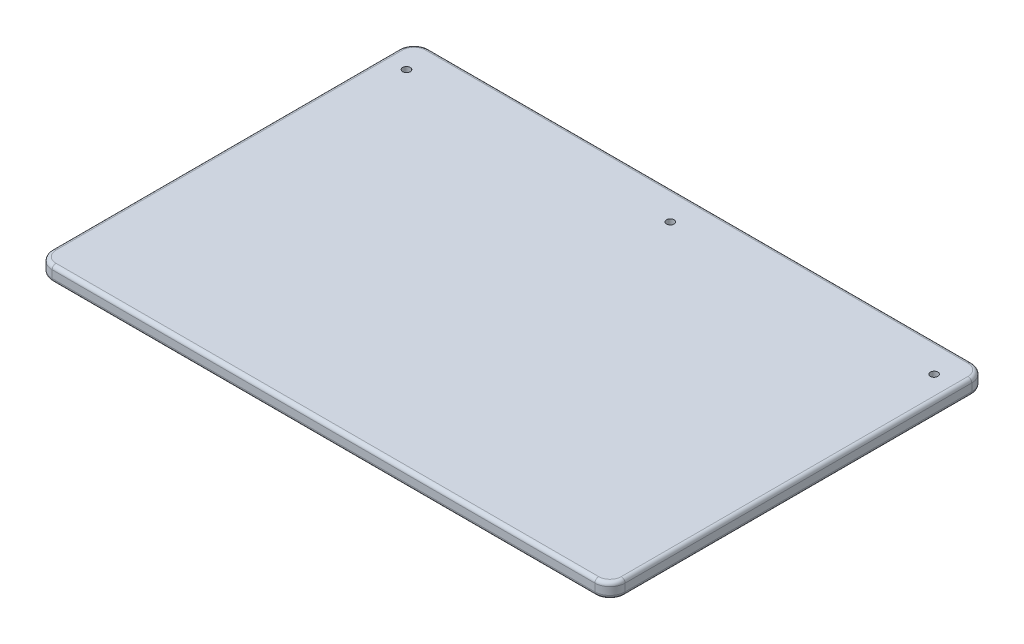
ISO-10303-21;
HEADER;
FILE_DESCRIPTION(('STEP AP214'),'2;1');
FILE_NAME('part.step','',(''),(''),'','','');
FILE_SCHEMA(('AUTOMOTIVE_DESIGN { 1 0 10303 214 1 1 1 1 }'));
ENDSEC;
DATA;
#1=APPLICATION_CONTEXT('core data for automotive mechanical design processes');
#2=APPLICATION_PROTOCOL_DEFINITION('international standard','automotive_design',2000,#1);
#3=PRODUCT_CONTEXT('',#1,'mechanical');
#4=PRODUCT('Part','Part','',(#3));
#5=PRODUCT_RELATED_PRODUCT_CATEGORY('part','',(#4));
#6=PRODUCT_DEFINITION_FORMATION('','',#4);
#7=PRODUCT_DEFINITION_CONTEXT('part definition',#1,'design');
#8=PRODUCT_DEFINITION('design','',#6,#7);
#9=PRODUCT_DEFINITION_SHAPE('','',#8);
#10=(LENGTH_UNIT() NAMED_UNIT(*) SI_UNIT(.MILLI.,.METRE.));
#11=(NAMED_UNIT(*) PLANE_ANGLE_UNIT() SI_UNIT($,.RADIAN.));
#12=(NAMED_UNIT(*) SI_UNIT($,.STERADIAN.) SOLID_ANGLE_UNIT());
#13=UNCERTAINTY_MEASURE_WITH_UNIT(LENGTH_MEASURE(1.E-05),#10,'distance_accuracy_value','');
#14=(GEOMETRIC_REPRESENTATION_CONTEXT(3) GLOBAL_UNCERTAINTY_ASSIGNED_CONTEXT((#13)) GLOBAL_UNIT_ASSIGNED_CONTEXT((#10,
#11,#12)) REPRESENTATION_CONTEXT('',''));
#15=CARTESIAN_POINT('',(0.,0.,0.));
#16=DIRECTION('',(0.,0.,1.));
#17=DIRECTION('',(1.,0.,0.));
#18=AXIS2_PLACEMENT_3D('',#15,#16,#17);
#19=CARTESIAN_POINT('',(190.,10.,125.));
#20=DIRECTION('',(-1.,0.,0.));
#21=DIRECTION('',(0.,0.,1.));
#22=AXIS2_PLACEMENT_3D('',#19,#20,#21);
#23=PLANE('',#22);
#24=DIRECTION('',(0.,0.,-1.));
#25=VECTOR('',#24,1.);
#26=CARTESIAN_POINT('',(190.,2.5,-125.));
#27=LINE('',#26,#25);
#28=CARTESIAN_POINT('',(190.,2.5,115.));
#29=VERTEX_POINT('',#28);
#30=CARTESIAN_POINT('',(190.,2.5,-115.));
#31=VERTEX_POINT('',#30);
#32=EDGE_CURVE('E44',#29,#31,#27,.T.);
#33=ORIENTED_EDGE('',*,*,#32,.T.);
#34=DIRECTION('',(0.,-1.,0.));
#35=VECTOR('',#34,1.);
#36=CARTESIAN_POINT('',(190.,10.,-115.));
#37=LINE('',#36,#35);
#38=CARTESIAN_POINT('',(190.,7.5,-115.));
#39=VERTEX_POINT('',#38);
#40=EDGE_CURVE('E12',#31,#39,#37,.F.);
#41=ORIENTED_EDGE('',*,*,#40,.T.);
#42=DIRECTION('',(0.,0.,-1.));
#43=VECTOR('',#42,1.);
#44=CARTESIAN_POINT('',(190.,7.5,125.));
#45=LINE('',#44,#43);
#46=CARTESIAN_POINT('',(190.,7.5,115.));
#47=VERTEX_POINT('',#46);
#48=EDGE_CURVE('E250',#39,#47,#45,.F.);
#49=ORIENTED_EDGE('',*,*,#48,.T.);
#50=DIRECTION('',(0.,-1.,0.));
#51=VECTOR('',#50,1.);
#52=CARTESIAN_POINT('',(190.,10.,115.));
#53=LINE('',#52,#51);
#54=EDGE_CURVE('E248',#47,#29,#53,.T.);
#55=ORIENTED_EDGE('',*,*,#54,.T.);
#56=EDGE_LOOP('',(#33,#41,#49,#55));
#57=FACE_BOUND('',#56,.T.);
#58=ADVANCED_FACE('F35',(#57),#23,.F.);
#59=CARTESIAN_POINT('',(-190.,10.,-125.));
#60=DIRECTION('',(0.,0.,1.));
#61=DIRECTION('',(1.,0.,0.));
#62=AXIS2_PLACEMENT_3D('',#59,#60,#61);
#63=PLANE('',#62);
#64=DIRECTION('',(-1.,0.,0.));
#65=VECTOR('',#64,1.);
#66=CARTESIAN_POINT('',(-190.,7.5,-125.));
#67=LINE('',#66,#65);
#68=CARTESIAN_POINT('',(-180.,7.5,-125.));
#69=VERTEX_POINT('',#68);
#70=CARTESIAN_POINT('',(180.,7.5,-125.));
#71=VERTEX_POINT('',#70);
#72=EDGE_CURVE('E241',#69,#71,#67,.F.);
#73=ORIENTED_EDGE('',*,*,#72,.T.);
#74=DIRECTION('',(0.,-1.,0.));
#75=VECTOR('',#74,1.);
#76=CARTESIAN_POINT('',(180.,10.,-125.));
#77=LINE('',#76,#75);
#78=CARTESIAN_POINT('',(180.,2.5,-125.));
#79=VERTEX_POINT('',#78);
#80=EDGE_CURVE('E246',#71,#79,#77,.T.);
#81=ORIENTED_EDGE('',*,*,#80,.T.);
#82=DIRECTION('',(-1.,0.,0.));
#83=VECTOR('',#82,1.);
#84=CARTESIAN_POINT('',(-190.,2.5,-125.));
#85=LINE('',#84,#83);
#86=CARTESIAN_POINT('',(-180.,2.5,-125.));
#87=VERTEX_POINT('',#86);
#88=EDGE_CURVE('E243',#79,#87,#85,.T.);
#89=ORIENTED_EDGE('',*,*,#88,.T.);
#90=DIRECTION('',(0.,-1.,0.));
#91=VECTOR('',#90,1.);
#92=CARTESIAN_POINT('',(-180.,10.,-125.));
#93=LINE('',#92,#91);
#94=EDGE_CURVE('E239',#87,#69,#93,.F.);
#95=ORIENTED_EDGE('',*,*,#94,.T.);
#96=EDGE_LOOP('',(#73,#81,#89,#95));
#97=FACE_BOUND('',#96,.T.);
#98=ADVANCED_FACE('F340',(#97),#63,.F.);
#99=CARTESIAN_POINT('',(-190.,10.,125.));
#100=DIRECTION('',(1.,0.,0.));
#101=DIRECTION('',(0.,0.,-1.));
#102=AXIS2_PLACEMENT_3D('',#99,#100,#101);
#103=PLANE('',#102);
#104=DIRECTION('',(0.,0.,1.));
#105=VECTOR('',#104,1.);
#106=CARTESIAN_POINT('',(-190.,7.5,125.));
#107=LINE('',#106,#105);
#108=CARTESIAN_POINT('',(-190.,7.5,115.));
#109=VERTEX_POINT('',#108);
#110=CARTESIAN_POINT('',(-190.,7.5,-115.));
#111=VERTEX_POINT('',#110);
#112=EDGE_CURVE('E232',#109,#111,#107,.F.);
#113=ORIENTED_EDGE('',*,*,#112,.T.);
#114=DIRECTION('',(0.,-1.,0.));
#115=VECTOR('',#114,1.);
#116=CARTESIAN_POINT('',(-190.,10.,-115.));
#117=LINE('',#116,#115);
#118=CARTESIAN_POINT('',(-190.,2.5,-115.));
#119=VERTEX_POINT('',#118);
#120=EDGE_CURVE('E237',#111,#119,#117,.T.);
#121=ORIENTED_EDGE('',*,*,#120,.T.);
#122=DIRECTION('',(0.,0.,1.));
#123=VECTOR('',#122,1.);
#124=CARTESIAN_POINT('',(-190.,2.5,125.));
#125=LINE('',#124,#123);
#126=CARTESIAN_POINT('',(-190.,2.5,115.));
#127=VERTEX_POINT('',#126);
#128=EDGE_CURVE('E234',#119,#127,#125,.T.);
#129=ORIENTED_EDGE('',*,*,#128,.T.);
#130=DIRECTION('',(0.,-1.,0.));
#131=VECTOR('',#130,1.);
#132=CARTESIAN_POINT('',(-190.,10.,115.));
#133=LINE('',#132,#131);
#134=EDGE_CURVE('E230',#127,#109,#133,.F.);
#135=ORIENTED_EDGE('',*,*,#134,.T.);
#136=EDGE_LOOP('',(#113,#121,#129,#135));
#137=FACE_BOUND('',#136,.T.);
#138=ADVANCED_FACE('F320',(#137),#103,.F.);
#139=CARTESIAN_POINT('',(-190.,10.,125.));
#140=DIRECTION('',(0.,0.,-1.));
#141=DIRECTION('',(-1.,0.,0.));
#142=AXIS2_PLACEMENT_3D('',#139,#140,#141);
#143=PLANE('',#142);
#144=DIRECTION('',(1.,0.,0.));
#145=VECTOR('',#144,1.);
#146=CARTESIAN_POINT('',(-190.,7.5,125.));
#147=LINE('',#146,#145);
#148=CARTESIAN_POINT('',(180.,7.5,125.));
#149=VERTEX_POINT('',#148);
#150=CARTESIAN_POINT('',(-180.,7.5,125.));
#151=VERTEX_POINT('',#150);
#152=EDGE_CURVE('E182',#149,#151,#147,.F.);
#153=ORIENTED_EDGE('',*,*,#152,.T.);
#154=DIRECTION('',(0.,-1.,0.));
#155=VECTOR('',#154,1.);
#156=CARTESIAN_POINT('',(-180.,10.,125.));
#157=LINE('',#156,#155);
#158=CARTESIAN_POINT('',(-180.,2.5,125.));
#159=VERTEX_POINT('',#158);
#160=EDGE_CURVE('E186',#151,#159,#157,.T.);
#161=ORIENTED_EDGE('',*,*,#160,.T.);
#162=DIRECTION('',(1.,0.,0.));
#163=VECTOR('',#162,1.);
#164=CARTESIAN_POINT('',(190.,2.5,125.));
#165=LINE('',#164,#163);
#166=CARTESIAN_POINT('',(180.,2.5,125.));
#167=VERTEX_POINT('',#166);
#168=EDGE_CURVE('E156',#159,#167,#165,.T.);
#169=ORIENTED_EDGE('',*,*,#168,.T.);
#170=DIRECTION('',(0.,-1.,0.));
#171=VECTOR('',#170,1.);
#172=CARTESIAN_POINT('',(180.,10.,125.));
#173=LINE('',#172,#171);
#174=EDGE_CURVE('E176',#167,#149,#173,.F.);
#175=ORIENTED_EDGE('',*,*,#174,.T.);
#176=EDGE_LOOP('',(#153,#161,#169,#175));
#177=FACE_BOUND('',#176,.T.);
#178=ADVANCED_FACE('F184',(#177),#143,.F.);
#179=CARTESIAN_POINT('',(0.,10.,0.));
#180=DIRECTION('',(0.,-1.,0.));
#181=DIRECTION('',(0.,0.,-1.));
#182=AXIS2_PLACEMENT_3D('',#179,#180,#181);
#183=PLANE('',#182);
#184=CARTESIAN_POINT('',(-175.,10.,-105.));
#185=DIRECTION('',(0.,-1.,0.));
#186=DIRECTION('',(0.,0.,-1.));
#187=AXIS2_PLACEMENT_3D('',#184,#185,#186);
#188=CIRCLE('',#187,2.5);
#189=CARTESIAN_POINT('',(-175.,10.,-107.5));
#190=VERTEX_POINT('',#189);
#191=EDGE_CURVE('E162',#190,#190,#188,.T.);
#192=ORIENTED_EDGE('',*,*,#191,.T.);
#193=EDGE_LOOP('',(#192));
#194=FACE_BOUND('',#193,.T.);
#195=CARTESIAN_POINT('',(0.,10.,-105.));
#196=DIRECTION('',(0.,-1.,0.));
#197=DIRECTION('',(0.,0.,-1.));
#198=AXIS2_PLACEMENT_3D('',#195,#196,#197);
#199=CIRCLE('',#198,2.5);
#200=CARTESIAN_POINT('',(0.,10.,-107.5));
#201=VERTEX_POINT('',#200);
#202=EDGE_CURVE('E607',#201,#201,#199,.T.);
#203=ORIENTED_EDGE('',*,*,#202,.T.);
#204=EDGE_LOOP('',(#203));
#205=FACE_BOUND('',#204,.T.);
#206=CARTESIAN_POINT('',(175.,10.,-105.));
#207=DIRECTION('',(0.,-1.,0.));
#208=DIRECTION('',(0.,0.,-1.));
#209=AXIS2_PLACEMENT_3D('',#206,#207,#208);
#210=CIRCLE('',#209,2.5);
#211=CARTESIAN_POINT('',(175.,10.,-107.5));
#212=VERTEX_POINT('',#211);
#213=EDGE_CURVE('E610',#212,#212,#210,.T.);
#214=ORIENTED_EDGE('',*,*,#213,.T.);
#215=EDGE_LOOP('',(#214));
#216=FACE_BOUND('',#215,.T.);
#217=CARTESIAN_POINT('',(-180.,10.,-115.));
#218=DIRECTION('',(0.,-1.,0.));
#219=DIRECTION('',(0.,0.,-1.));
#220=AXIS2_PLACEMENT_3D('',#217,#218,#219);
#221=CIRCLE('',#220,7.5);
#222=CARTESIAN_POINT('',(-187.5,10.,-115.));
#223=VERTEX_POINT('',#222);
#224=CARTESIAN_POINT('',(-180.,10.,-122.5));
#225=VERTEX_POINT('',#224);
#226=EDGE_CURVE('E222',#223,#225,#221,.T.);
#227=ORIENTED_EDGE('',*,*,#226,.F.);
#228=DIRECTION('',(0.,0.,1.));
#229=VECTOR('',#228,1.);
#230=CARTESIAN_POINT('',(-187.5,10.,0.));
#231=LINE('',#230,#229);
#232=CARTESIAN_POINT('',(-187.5,10.,115.));
#233=VERTEX_POINT('',#232);
#234=EDGE_CURVE('E228',#223,#233,#231,.T.);
#235=ORIENTED_EDGE('',*,*,#234,.T.);
#236=CARTESIAN_POINT('',(-180.,10.,115.));
#237=DIRECTION('',(0.,-1.,0.));
#238=DIRECTION('',(0.,0.,-1.));
#239=AXIS2_PLACEMENT_3D('',#236,#237,#238);
#240=CIRCLE('',#239,7.5);
#241=CARTESIAN_POINT('',(-180.,10.,122.5));
#242=VERTEX_POINT('',#241);
#243=EDGE_CURVE('E225',#242,#233,#240,.T.);
#244=ORIENTED_EDGE('',*,*,#243,.F.);
#245=DIRECTION('',(1.,0.,0.));
#246=VECTOR('',#245,1.);
#247=CARTESIAN_POINT('',(0.,10.,122.5));
#248=LINE('',#247,#246);
#249=CARTESIAN_POINT('',(180.,10.,122.5));
#250=VERTEX_POINT('',#249);
#251=EDGE_CURVE('E219',#242,#250,#248,.T.);
#252=ORIENTED_EDGE('',*,*,#251,.T.);
#253=CARTESIAN_POINT('',(180.,10.,115.));
#254=DIRECTION('',(0.,-1.,0.));
#255=DIRECTION('',(0.,0.,-1.));
#256=AXIS2_PLACEMENT_3D('',#253,#254,#255);
#257=CIRCLE('',#256,7.5);
#258=CARTESIAN_POINT('',(187.5,10.,115.));
#259=VERTEX_POINT('',#258);
#260=EDGE_CURVE('E217',#259,#250,#257,.T.);
#261=ORIENTED_EDGE('',*,*,#260,.F.);
#262=DIRECTION('',(0.,0.,-1.));
#263=VECTOR('',#262,1.);
#264=CARTESIAN_POINT('',(187.5,10.,0.));
#265=LINE('',#264,#263);
#266=CARTESIAN_POINT('',(187.5,10.,-115.));
#267=VERTEX_POINT('',#266);
#268=EDGE_CURVE('E213',#259,#267,#265,.T.);
#269=ORIENTED_EDGE('',*,*,#268,.T.);
#270=CARTESIAN_POINT('',(180.,10.,-115.));
#271=DIRECTION('',(0.,-1.,0.));
#272=DIRECTION('',(0.,0.,-1.));
#273=AXIS2_PLACEMENT_3D('',#270,#271,#272);
#274=CIRCLE('',#273,7.5);
#275=CARTESIAN_POINT('',(180.,10.,-122.5));
#276=VERTEX_POINT('',#275);
#277=EDGE_CURVE('E210',#276,#267,#274,.T.);
#278=ORIENTED_EDGE('',*,*,#277,.F.);
#279=DIRECTION('',(-1.,0.,0.));
#280=VECTOR('',#279,1.);
#281=CARTESIAN_POINT('',(0.,10.,-122.5));
#282=LINE('',#281,#280);
#283=EDGE_CURVE('E215',#276,#225,#282,.T.);
#284=ORIENTED_EDGE('',*,*,#283,.T.);
#285=EDGE_LOOP('',(#227,#235,#244,#252,#261,#269,#278,#284));
#286=FACE_BOUND('',#285,.T.);
#287=ADVANCED_FACE('F329',(#194,#205,#216,#286),#183,.F.);
#288=CARTESIAN_POINT('',(0.,0.,0.));
#289=DIRECTION('',(0.,-1.,0.));
#290=DIRECTION('',(0.,0.,-1.));
#291=AXIS2_PLACEMENT_3D('',#288,#289,#290);
#292=PLANE('',#291);
#293=CARTESIAN_POINT('',(-175.,0.,-105.));
#294=DIRECTION('',(0.,-1.,0.));
#295=DIRECTION('',(0.,0.,-1.));
#296=AXIS2_PLACEMENT_3D('',#293,#294,#295);
#297=CIRCLE('',#296,2.5);
#298=CARTESIAN_POINT('',(-175.,0.,-107.5));
#299=VERTEX_POINT('',#298);
#300=EDGE_CURVE('E620',#299,#299,#297,.T.);
#301=ORIENTED_EDGE('',*,*,#300,.F.);
#302=EDGE_LOOP('',(#301));
#303=FACE_BOUND('',#302,.T.);
#304=CARTESIAN_POINT('',(0.,0.,-105.));
#305=DIRECTION('',(0.,-1.,0.));
#306=DIRECTION('',(0.,0.,-1.));
#307=AXIS2_PLACEMENT_3D('',#304,#305,#306);
#308=CIRCLE('',#307,2.5);
#309=CARTESIAN_POINT('',(0.,0.,-107.5));
#310=VERTEX_POINT('',#309);
#311=EDGE_CURVE('E611',#310,#310,#308,.T.);
#312=ORIENTED_EDGE('',*,*,#311,.F.);
#313=EDGE_LOOP('',(#312));
#314=FACE_BOUND('',#313,.T.);
#315=CARTESIAN_POINT('',(175.,0.,-105.));
#316=DIRECTION('',(0.,-1.,0.));
#317=DIRECTION('',(0.,0.,-1.));
#318=AXIS2_PLACEMENT_3D('',#315,#316,#317);
#319=CIRCLE('',#318,2.5);
#320=CARTESIAN_POINT('',(175.,0.,-107.5));
#321=VERTEX_POINT('',#320);
#322=EDGE_CURVE('E612',#321,#321,#319,.T.);
#323=ORIENTED_EDGE('',*,*,#322,.F.);
#324=EDGE_LOOP('',(#323));
#325=FACE_BOUND('',#324,.T.);
#326=CARTESIAN_POINT('',(180.,0.,115.));
#327=DIRECTION('',(0.,-1.,0.));
#328=DIRECTION('',(0.,0.,-1.));
#329=AXIS2_PLACEMENT_3D('',#326,#327,#328);
#330=CIRCLE('',#329,7.5);
#331=CARTESIAN_POINT('',(180.,0.,122.5));
#332=VERTEX_POINT('',#331);
#333=CARTESIAN_POINT('',(187.5,0.,115.));
#334=VERTEX_POINT('',#333);
#335=EDGE_CURVE('E189',#332,#334,#330,.F.);
#336=ORIENTED_EDGE('',*,*,#335,.F.);
#337=DIRECTION('',(1.,0.,0.));
#338=VECTOR('',#337,1.);
#339=CARTESIAN_POINT('',(-190.,0.,122.5));
#340=LINE('',#339,#338);
#341=CARTESIAN_POINT('',(-180.,0.,122.5));
#342=VERTEX_POINT('',#341);
#343=EDGE_CURVE('E158',#332,#342,#340,.F.);
#344=ORIENTED_EDGE('',*,*,#343,.T.);
#345=CARTESIAN_POINT('',(-180.,0.,115.));
#346=DIRECTION('',(0.,-1.,0.));
#347=DIRECTION('',(0.,0.,-1.));
#348=AXIS2_PLACEMENT_3D('',#345,#346,#347);
#349=CIRCLE('',#348,7.5);
#350=CARTESIAN_POINT('',(-187.5,0.,115.));
#351=VERTEX_POINT('',#350);
#352=EDGE_CURVE('E206',#351,#342,#349,.F.);
#353=ORIENTED_EDGE('',*,*,#352,.F.);
#354=DIRECTION('',(0.,0.,1.));
#355=VECTOR('',#354,1.);
#356=CARTESIAN_POINT('',(-187.5,0.,-125.));
#357=LINE('',#356,#355);
#358=CARTESIAN_POINT('',(-187.5,0.,-115.));
#359=VERTEX_POINT('',#358);
#360=EDGE_CURVE('E204',#351,#359,#357,.F.);
#361=ORIENTED_EDGE('',*,*,#360,.T.);
#362=CARTESIAN_POINT('',(-180.,0.,-115.));
#363=DIRECTION('',(0.,-1.,0.));
#364=DIRECTION('',(0.,0.,-1.));
#365=AXIS2_PLACEMENT_3D('',#362,#363,#364);
#366=CIRCLE('',#365,7.5);
#367=CARTESIAN_POINT('',(-180.,0.,-122.5));
#368=VERTEX_POINT('',#367);
#369=EDGE_CURVE('E201',#368,#359,#366,.F.);
#370=ORIENTED_EDGE('',*,*,#369,.F.);
#371=DIRECTION('',(-1.,0.,0.));
#372=VECTOR('',#371,1.);
#373=CARTESIAN_POINT('',(190.,0.,-122.5));
#374=LINE('',#373,#372);
#375=CARTESIAN_POINT('',(180.,0.,-122.5));
#376=VERTEX_POINT('',#375);
#377=EDGE_CURVE('E199',#368,#376,#374,.F.);
#378=ORIENTED_EDGE('',*,*,#377,.T.);
#379=CARTESIAN_POINT('',(180.,0.,-115.));
#380=DIRECTION('',(0.,-1.,0.));
#381=DIRECTION('',(0.,0.,-1.));
#382=AXIS2_PLACEMENT_3D('',#379,#380,#381);
#383=CIRCLE('',#382,7.5);
#384=CARTESIAN_POINT('',(187.5,0.,-115.));
#385=VERTEX_POINT('',#384);
#386=EDGE_CURVE('E196',#385,#376,#383,.F.);
#387=ORIENTED_EDGE('',*,*,#386,.F.);
#388=DIRECTION('',(0.,0.,-1.));
#389=VECTOR('',#388,1.);
#390=CARTESIAN_POINT('',(187.5,0.,125.));
#391=LINE('',#390,#389);
#392=EDGE_CURVE('E194',#385,#334,#391,.F.);
#393=ORIENTED_EDGE('',*,*,#392,.T.);
#394=EDGE_LOOP('',(#336,#344,#353,#361,#370,#378,#387,#393));
#395=FACE_BOUND('',#394,.T.);
#396=ADVANCED_FACE('F371',(#303,#314,#325,#395),#292,.T.);
#397=CARTESIAN_POINT('',(0.,7.5,-122.5));
#398=DIRECTION('',(-1.,0.,0.));
#399=DIRECTION('',(0.,0.,1.));
#400=AXIS2_PLACEMENT_3D('',#397,#398,#399);
#401=CYLINDRICAL_SURFACE('',#400,2.5);
#402=CARTESIAN_POINT('',(-180.,7.5,-122.5));
#403=DIRECTION('',(-1.,0.,0.));
#404=DIRECTION('',(0.,0.,1.));
#405=AXIS2_PLACEMENT_3D('',#402,#403,#404);
#406=CIRCLE('',#405,2.5);
#407=EDGE_CURVE('E39',#225,#69,#406,.T.);
#408=ORIENTED_EDGE('',*,*,#407,.F.);
#409=ORIENTED_EDGE('',*,*,#283,.F.);
#410=CARTESIAN_POINT('',(180.,7.5,-122.5));
#411=DIRECTION('',(1.,0.,0.));
#412=DIRECTION('',(0.,0.,-1.));
#413=AXIS2_PLACEMENT_3D('',#410,#411,#412);
#414=CIRCLE('',#413,2.5);
#415=EDGE_CURVE('E299',#71,#276,#414,.T.);
#416=ORIENTED_EDGE('',*,*,#415,.F.);
#417=ORIENTED_EDGE('',*,*,#72,.F.);
#418=EDGE_LOOP('',(#408,#409,#416,#417));
#419=FACE_BOUND('',#418,.T.);
#420=ADVANCED_FACE('F37',(#419),#401,.T.);
#421=CARTESIAN_POINT('',(-180.,7.5,-115.));
#422=DIRECTION('',(0.,-1.,0.));
#423=DIRECTION('',(0.,0.,-1.));
#424=AXIS2_PLACEMENT_3D('',#421,#422,#423);
#425=TOROIDAL_SURFACE('',#424,7.5,2.5);
#426=ORIENTED_EDGE('',*,*,#226,.T.);
#427=ORIENTED_EDGE('',*,*,#407,.T.);
#428=CARTESIAN_POINT('',(-180.,7.5,-115.));
#429=DIRECTION('',(0.,-1.,0.));
#430=DIRECTION('',(0.,0.,-1.));
#431=AXIS2_PLACEMENT_3D('',#428,#429,#430);
#432=CIRCLE('',#431,10.);
#433=EDGE_CURVE('E297',#111,#69,#432,.T.);
#434=ORIENTED_EDGE('',*,*,#433,.F.);
#435=CARTESIAN_POINT('',(-187.5,7.5,-115.));
#436=DIRECTION('',(0.,0.,-1.));
#437=DIRECTION('',(-1.,0.,0.));
#438=AXIS2_PLACEMENT_3D('',#435,#436,#437);
#439=CIRCLE('',#438,2.5);
#440=EDGE_CURVE('E294',#223,#111,#439,.F.);
#441=ORIENTED_EDGE('',*,*,#440,.F.);
#442=EDGE_LOOP('',(#426,#427,#434,#441));
#443=FACE_BOUND('',#442,.T.);
#444=ADVANCED_FACE('F308',(#443),#425,.T.);
#445=CARTESIAN_POINT('',(180.,7.5,-115.));
#446=DIRECTION('',(0.,-1.,0.));
#447=DIRECTION('',(0.,0.,-1.));
#448=AXIS2_PLACEMENT_3D('',#445,#446,#447);
#449=TOROIDAL_SURFACE('',#448,7.5,2.5);
#450=ORIENTED_EDGE('',*,*,#415,.T.);
#451=ORIENTED_EDGE('',*,*,#277,.T.);
#452=CARTESIAN_POINT('',(187.5,7.5,-115.));
#453=DIRECTION('',(0.,0.,-1.));
#454=DIRECTION('',(-1.,0.,0.));
#455=AXIS2_PLACEMENT_3D('',#452,#453,#454);
#456=CIRCLE('',#455,2.5);
#457=EDGE_CURVE('E291',#39,#267,#456,.F.);
#458=ORIENTED_EDGE('',*,*,#457,.F.);
#459=CARTESIAN_POINT('',(180.,7.5,-115.));
#460=DIRECTION('',(0.,-1.,0.));
#461=DIRECTION('',(0.,0.,-1.));
#462=AXIS2_PLACEMENT_3D('',#459,#460,#461);
#463=CIRCLE('',#462,10.);
#464=EDGE_CURVE('E289',#71,#39,#463,.T.);
#465=ORIENTED_EDGE('',*,*,#464,.F.);
#466=EDGE_LOOP('',(#450,#451,#458,#465));
#467=FACE_BOUND('',#466,.T.);
#468=ADVANCED_FACE('F333',(#467),#449,.T.);
#469=CARTESIAN_POINT('',(-180.,10.,-115.));
#470=DIRECTION('',(0.,-1.,0.));
#471=DIRECTION('',(0.,0.,-1.));
#472=AXIS2_PLACEMENT_3D('',#469,#470,#471);
#473=CYLINDRICAL_SURFACE('',#472,10.);
#474=ORIENTED_EDGE('',*,*,#433,.T.);
#475=ORIENTED_EDGE('',*,*,#94,.F.);
#476=CARTESIAN_POINT('',(-180.,2.5,-115.));
#477=DIRECTION('',(0.,-1.,0.));
#478=DIRECTION('',(0.,0.,-1.));
#479=AXIS2_PLACEMENT_3D('',#476,#477,#478);
#480=CIRCLE('',#479,10.);
#481=EDGE_CURVE('E284',#119,#87,#480,.T.);
#482=ORIENTED_EDGE('',*,*,#481,.F.);
#483=ORIENTED_EDGE('',*,*,#120,.F.);
#484=EDGE_LOOP('',(#474,#475,#482,#483));
#485=FACE_BOUND('',#484,.T.);
#486=ADVANCED_FACE('F316',(#485),#473,.T.);
#487=CARTESIAN_POINT('',(-187.5,7.5,0.));
#488=DIRECTION('',(0.,0.,1.));
#489=DIRECTION('',(1.,0.,0.));
#490=AXIS2_PLACEMENT_3D('',#487,#488,#489);
#491=CYLINDRICAL_SURFACE('',#490,2.5);
#492=ORIENTED_EDGE('',*,*,#440,.T.);
#493=ORIENTED_EDGE('',*,*,#112,.F.);
#494=CARTESIAN_POINT('',(-187.5,7.5,115.));
#495=DIRECTION('',(0.,0.,1.));
#496=DIRECTION('',(1.,0.,0.));
#497=AXIS2_PLACEMENT_3D('',#494,#495,#496);
#498=CIRCLE('',#497,2.5);
#499=EDGE_CURVE('E281',#233,#109,#498,.T.);
#500=ORIENTED_EDGE('',*,*,#499,.F.);
#501=ORIENTED_EDGE('',*,*,#234,.F.);
#502=EDGE_LOOP('',(#492,#493,#500,#501));
#503=FACE_BOUND('',#502,.T.);
#504=ADVANCED_FACE('F327',(#503),#491,.T.);
#505=CARTESIAN_POINT('',(0.,7.5,122.5));
#506=DIRECTION('',(1.,0.,0.));
#507=DIRECTION('',(0.,0.,-1.));
#508=AXIS2_PLACEMENT_3D('',#505,#506,#507);
#509=CYLINDRICAL_SURFACE('',#508,2.5);
#510=CARTESIAN_POINT('',(180.,7.5,122.5));
#511=DIRECTION('',(1.,0.,0.));
#512=DIRECTION('',(0.,0.,-1.));
#513=AXIS2_PLACEMENT_3D('',#510,#511,#512);
#514=CIRCLE('',#513,2.5);
#515=EDGE_CURVE('E275',#250,#149,#514,.T.);
#516=ORIENTED_EDGE('',*,*,#515,.F.);
#517=ORIENTED_EDGE('',*,*,#251,.F.);
#518=CARTESIAN_POINT('',(-180.,7.5,122.5));
#519=DIRECTION('',(-1.,0.,0.));
#520=DIRECTION('',(0.,0.,1.));
#521=AXIS2_PLACEMENT_3D('',#518,#519,#520);
#522=CIRCLE('',#521,2.5);
#523=EDGE_CURVE('E278',#151,#242,#522,.T.);
#524=ORIENTED_EDGE('',*,*,#523,.F.);
#525=ORIENTED_EDGE('',*,*,#152,.F.);
#526=EDGE_LOOP('',(#516,#517,#524,#525));
#527=FACE_BOUND('',#526,.T.);
#528=ADVANCED_FACE('F362',(#527),#509,.T.);
#529=CARTESIAN_POINT('',(187.5,7.5,0.));
#530=DIRECTION('',(0.,0.,-1.));
#531=DIRECTION('',(-1.,0.,0.));
#532=AXIS2_PLACEMENT_3D('',#529,#530,#531);
#533=CYLINDRICAL_SURFACE('',#532,2.5);
#534=ORIENTED_EDGE('',*,*,#457,.T.);
#535=ORIENTED_EDGE('',*,*,#268,.F.);
#536=CARTESIAN_POINT('',(187.5,7.5,115.));
#537=DIRECTION('',(0.,0.,1.));
#538=DIRECTION('',(1.,0.,0.));
#539=AXIS2_PLACEMENT_3D('',#536,#537,#538);
#540=CIRCLE('',#539,2.5);
#541=EDGE_CURVE('E272',#47,#259,#540,.T.);
#542=ORIENTED_EDGE('',*,*,#541,.F.);
#543=ORIENTED_EDGE('',*,*,#48,.F.);
#544=EDGE_LOOP('',(#534,#535,#542,#543));
#545=FACE_BOUND('',#544,.T.);
#546=ADVANCED_FACE('F367',(#545),#533,.T.);
#547=CARTESIAN_POINT('',(180.,10.,-115.));
#548=DIRECTION('',(0.,-1.,0.));
#549=DIRECTION('',(0.,0.,-1.));
#550=AXIS2_PLACEMENT_3D('',#547,#548,#549);
#551=CYLINDRICAL_SURFACE('',#550,10.);
#552=ORIENTED_EDGE('',*,*,#464,.T.);
#553=ORIENTED_EDGE('',*,*,#40,.F.);
#554=CARTESIAN_POINT('',(180.,2.5,-115.));
#555=DIRECTION('',(0.,-1.,0.));
#556=DIRECTION('',(0.,0.,-1.));
#557=AXIS2_PLACEMENT_3D('',#554,#555,#556);
#558=CIRCLE('',#557,10.);
#559=EDGE_CURVE('E270',#79,#31,#558,.T.);
#560=ORIENTED_EDGE('',*,*,#559,.F.);
#561=ORIENTED_EDGE('',*,*,#80,.F.);
#562=EDGE_LOOP('',(#552,#553,#560,#561));
#563=FACE_BOUND('',#562,.T.);
#564=ADVANCED_FACE('F337',(#563),#551,.T.);
#565=CARTESIAN_POINT('',(-190.,2.5,-122.5));
#566=DIRECTION('',(1.,0.,0.));
#567=DIRECTION('',(0.,0.,-1.));
#568=AXIS2_PLACEMENT_3D('',#565,#566,#567);
#569=CYLINDRICAL_SURFACE('',#568,2.5);
#570=CARTESIAN_POINT('',(180.,2.5,-122.5));
#571=DIRECTION('',(1.,0.,0.));
#572=DIRECTION('',(0.,0.,-1.));
#573=AXIS2_PLACEMENT_3D('',#570,#571,#572);
#574=CIRCLE('',#573,2.5);
#575=EDGE_CURVE('E267',#376,#79,#574,.T.);
#576=ORIENTED_EDGE('',*,*,#575,.F.);
#577=ORIENTED_EDGE('',*,*,#377,.F.);
#578=CARTESIAN_POINT('',(-180.,2.5,-122.5));
#579=DIRECTION('',(-1.,0.,0.));
#580=DIRECTION('',(0.,0.,1.));
#581=AXIS2_PLACEMENT_3D('',#578,#579,#580);
#582=CIRCLE('',#581,2.5);
#583=EDGE_CURVE('E286',#87,#368,#582,.T.);
#584=ORIENTED_EDGE('',*,*,#583,.F.);
#585=ORIENTED_EDGE('',*,*,#88,.F.);
#586=EDGE_LOOP('',(#576,#577,#584,#585));
#587=FACE_BOUND('',#586,.T.);
#588=ADVANCED_FACE('F344',(#587),#569,.T.);
#589=CARTESIAN_POINT('',(-180.,2.5,-115.));
#590=DIRECTION('',(0.,-1.,0.));
#591=DIRECTION('',(0.,0.,-1.));
#592=AXIS2_PLACEMENT_3D('',#589,#590,#591);
#593=TOROIDAL_SURFACE('',#592,7.5,2.5);
#594=ORIENTED_EDGE('',*,*,#583,.T.);
#595=ORIENTED_EDGE('',*,*,#369,.T.);
#596=CARTESIAN_POINT('',(-187.5,2.5,-115.));
#597=DIRECTION('',(0.,0.,-1.));
#598=DIRECTION('',(-1.,0.,0.));
#599=AXIS2_PLACEMENT_3D('',#596,#597,#598);
#600=CIRCLE('',#599,2.5);
#601=EDGE_CURVE('E264',#119,#359,#600,.F.);
#602=ORIENTED_EDGE('',*,*,#601,.F.);
#603=ORIENTED_EDGE('',*,*,#481,.T.);
#604=EDGE_LOOP('',(#594,#595,#602,#603));
#605=FACE_BOUND('',#604,.T.);
#606=ADVANCED_FACE('F347',(#605),#593,.T.);
#607=CARTESIAN_POINT('',(-180.,7.5,115.));
#608=DIRECTION('',(0.,-1.,0.));
#609=DIRECTION('',(0.,0.,-1.));
#610=AXIS2_PLACEMENT_3D('',#607,#608,#609);
#611=TOROIDAL_SURFACE('',#610,7.5,2.5);
#612=ORIENTED_EDGE('',*,*,#243,.T.);
#613=ORIENTED_EDGE('',*,*,#499,.T.);
#614=CARTESIAN_POINT('',(-180.,7.5,115.));
#615=DIRECTION('',(0.,-1.,0.));
#616=DIRECTION('',(0.,0.,-1.));
#617=AXIS2_PLACEMENT_3D('',#614,#615,#616);
#618=CIRCLE('',#617,10.);
#619=EDGE_CURVE('E261',#151,#109,#618,.T.);
#620=ORIENTED_EDGE('',*,*,#619,.F.);
#621=ORIENTED_EDGE('',*,*,#523,.T.);
#622=EDGE_LOOP('',(#612,#613,#620,#621));
#623=FACE_BOUND('',#622,.T.);
#624=ADVANCED_FACE('F358',(#623),#611,.T.);
#625=CARTESIAN_POINT('',(180.,7.5,115.));
#626=DIRECTION('',(0.,-1.,0.));
#627=DIRECTION('',(0.,0.,-1.));
#628=AXIS2_PLACEMENT_3D('',#625,#626,#627);
#629=TOROIDAL_SURFACE('',#628,7.5,2.5);
#630=ORIENTED_EDGE('',*,*,#260,.T.);
#631=ORIENTED_EDGE('',*,*,#515,.T.);
#632=CARTESIAN_POINT('',(180.,7.5,115.));
#633=DIRECTION('',(0.,-1.,0.));
#634=DIRECTION('',(0.,0.,-1.));
#635=AXIS2_PLACEMENT_3D('',#632,#633,#634);
#636=CIRCLE('',#635,10.);
#637=EDGE_CURVE('E179',#47,#149,#636,.T.);
#638=ORIENTED_EDGE('',*,*,#637,.F.);
#639=ORIENTED_EDGE('',*,*,#541,.T.);
#640=EDGE_LOOP('',(#630,#631,#638,#639));
#641=FACE_BOUND('',#640,.T.);
#642=ADVANCED_FACE('F368',(#641),#629,.T.);
#643=CARTESIAN_POINT('',(180.,2.5,-115.));
#644=DIRECTION('',(0.,-1.,0.));
#645=DIRECTION('',(0.,0.,-1.));
#646=AXIS2_PLACEMENT_3D('',#643,#644,#645);
#647=TOROIDAL_SURFACE('',#646,7.5,2.5);
#648=ORIENTED_EDGE('',*,*,#575,.T.);
#649=ORIENTED_EDGE('',*,*,#559,.T.);
#650=CARTESIAN_POINT('',(187.5,2.5,-115.));
#651=DIRECTION('',(0.,0.,-1.));
#652=DIRECTION('',(-1.,0.,0.));
#653=AXIS2_PLACEMENT_3D('',#650,#651,#652);
#654=CIRCLE('',#653,2.5);
#655=EDGE_CURVE('E52',#385,#31,#654,.F.);
#656=ORIENTED_EDGE('',*,*,#655,.F.);
#657=ORIENTED_EDGE('',*,*,#386,.T.);
#658=EDGE_LOOP('',(#648,#649,#656,#657));
#659=FACE_BOUND('',#658,.T.);
#660=ADVANCED_FACE('F373',(#659),#647,.T.);
#661=CARTESIAN_POINT('',(-187.5,2.5,125.));
#662=DIRECTION('',(0.,0.,-1.));
#663=DIRECTION('',(-1.,0.,0.));
#664=AXIS2_PLACEMENT_3D('',#661,#662,#663);
#665=CYLINDRICAL_SURFACE('',#664,2.5);
#666=ORIENTED_EDGE('',*,*,#601,.T.);
#667=ORIENTED_EDGE('',*,*,#360,.F.);
#668=CARTESIAN_POINT('',(-187.5,2.5,115.));
#669=DIRECTION('',(0.,0.,1.));
#670=DIRECTION('',(1.,0.,0.));
#671=AXIS2_PLACEMENT_3D('',#668,#669,#670);
#672=CIRCLE('',#671,2.5);
#673=EDGE_CURVE('E256',#127,#351,#672,.T.);
#674=ORIENTED_EDGE('',*,*,#673,.F.);
#675=ORIENTED_EDGE('',*,*,#128,.F.);
#676=EDGE_LOOP('',(#666,#667,#674,#675));
#677=FACE_BOUND('',#676,.T.);
#678=ADVANCED_FACE('F351',(#677),#665,.T.);
#679=CARTESIAN_POINT('',(-180.,10.,115.));
#680=DIRECTION('',(0.,-1.,0.));
#681=DIRECTION('',(0.,0.,-1.));
#682=AXIS2_PLACEMENT_3D('',#679,#680,#681);
#683=CYLINDRICAL_SURFACE('',#682,10.);
#684=ORIENTED_EDGE('',*,*,#619,.T.);
#685=ORIENTED_EDGE('',*,*,#134,.F.);
#686=CARTESIAN_POINT('',(-180.,2.5,115.));
#687=DIRECTION('',(0.,-1.,0.));
#688=DIRECTION('',(0.,0.,-1.));
#689=AXIS2_PLACEMENT_3D('',#686,#687,#688);
#690=CIRCLE('',#689,10.);
#691=EDGE_CURVE('E173',#159,#127,#690,.T.);
#692=ORIENTED_EDGE('',*,*,#691,.F.);
#693=ORIENTED_EDGE('',*,*,#160,.F.);
#694=EDGE_LOOP('',(#684,#685,#692,#693));
#695=FACE_BOUND('',#694,.T.);
#696=ADVANCED_FACE('F354',(#695),#683,.T.);
#697=CARTESIAN_POINT('',(180.,10.,115.));
#698=DIRECTION('',(0.,-1.,0.));
#699=DIRECTION('',(0.,0.,-1.));
#700=AXIS2_PLACEMENT_3D('',#697,#698,#699);
#701=CYLINDRICAL_SURFACE('',#700,10.);
#702=ORIENTED_EDGE('',*,*,#637,.T.);
#703=ORIENTED_EDGE('',*,*,#174,.F.);
#704=CARTESIAN_POINT('',(180.,2.5,115.));
#705=DIRECTION('',(0.,-1.,0.));
#706=DIRECTION('',(0.,0.,-1.));
#707=AXIS2_PLACEMENT_3D('',#704,#705,#706);
#708=CIRCLE('',#707,10.);
#709=EDGE_CURVE('E166',#29,#167,#708,.T.);
#710=ORIENTED_EDGE('',*,*,#709,.F.);
#711=ORIENTED_EDGE('',*,*,#54,.F.);
#712=EDGE_LOOP('',(#702,#703,#710,#711));
#713=FACE_BOUND('',#712,.T.);
#714=ADVANCED_FACE('F177',(#713),#701,.T.);
#715=CARTESIAN_POINT('',(187.5,2.5,125.));
#716=DIRECTION('',(0.,0.,1.));
#717=DIRECTION('',(1.,0.,0.));
#718=AXIS2_PLACEMENT_3D('',#715,#716,#717);
#719=CYLINDRICAL_SURFACE('',#718,2.5);
#720=ORIENTED_EDGE('',*,*,#655,.T.);
#721=ORIENTED_EDGE('',*,*,#32,.F.);
#722=CARTESIAN_POINT('',(187.5,2.5,115.));
#723=DIRECTION('',(0.,0.,1.));
#724=DIRECTION('',(1.,0.,0.));
#725=AXIS2_PLACEMENT_3D('',#722,#723,#724);
#726=CIRCLE('',#725,2.5);
#727=EDGE_CURVE('E170',#334,#29,#726,.T.);
#728=ORIENTED_EDGE('',*,*,#727,.F.);
#729=ORIENTED_EDGE('',*,*,#392,.F.);
#730=EDGE_LOOP('',(#720,#721,#728,#729));
#731=FACE_BOUND('',#730,.T.);
#732=ADVANCED_FACE('F369',(#731),#719,.T.);
#733=CARTESIAN_POINT('',(-180.,2.5,115.));
#734=DIRECTION('',(0.,-1.,0.));
#735=DIRECTION('',(0.,0.,-1.));
#736=AXIS2_PLACEMENT_3D('',#733,#734,#735);
#737=TOROIDAL_SURFACE('',#736,7.5,2.5);
#738=ORIENTED_EDGE('',*,*,#673,.T.);
#739=ORIENTED_EDGE('',*,*,#352,.T.);
#740=CARTESIAN_POINT('',(-180.,2.5,122.5));
#741=DIRECTION('',(-1.,0.,0.));
#742=DIRECTION('',(0.,0.,1.));
#743=AXIS2_PLACEMENT_3D('',#740,#741,#742);
#744=CIRCLE('',#743,2.5);
#745=EDGE_CURVE('E161',#159,#342,#744,.F.);
#746=ORIENTED_EDGE('',*,*,#745,.F.);
#747=ORIENTED_EDGE('',*,*,#691,.T.);
#748=EDGE_LOOP('',(#738,#739,#746,#747));
#749=FACE_BOUND('',#748,.T.);
#750=ADVANCED_FACE('F395',(#749),#737,.T.);
#751=CARTESIAN_POINT('',(180.,2.5,115.));
#752=DIRECTION('',(0.,-1.,0.));
#753=DIRECTION('',(0.,0.,-1.));
#754=AXIS2_PLACEMENT_3D('',#751,#752,#753);
#755=TOROIDAL_SURFACE('',#754,7.5,2.5);
#756=ORIENTED_EDGE('',*,*,#727,.T.);
#757=ORIENTED_EDGE('',*,*,#709,.T.);
#758=CARTESIAN_POINT('',(180.,2.5,122.5));
#759=DIRECTION('',(1.,0.,0.));
#760=DIRECTION('',(0.,0.,-1.));
#761=AXIS2_PLACEMENT_3D('',#758,#759,#760);
#762=CIRCLE('',#761,2.5);
#763=EDGE_CURVE('E152',#332,#167,#762,.F.);
#764=ORIENTED_EDGE('',*,*,#763,.F.);
#765=ORIENTED_EDGE('',*,*,#335,.T.);
#766=EDGE_LOOP('',(#756,#757,#764,#765));
#767=FACE_BOUND('',#766,.T.);
#768=ADVANCED_FACE('F168',(#767),#755,.T.);
#769=CARTESIAN_POINT('',(-190.,2.5,122.5));
#770=DIRECTION('',(-1.,0.,0.));
#771=DIRECTION('',(0.,0.,1.));
#772=AXIS2_PLACEMENT_3D('',#769,#770,#771);
#773=CYLINDRICAL_SURFACE('',#772,2.5);
#774=ORIENTED_EDGE('',*,*,#745,.T.);
#775=ORIENTED_EDGE('',*,*,#343,.F.);
#776=ORIENTED_EDGE('',*,*,#763,.T.);
#777=ORIENTED_EDGE('',*,*,#168,.F.);
#778=EDGE_LOOP('',(#774,#775,#776,#777));
#779=FACE_BOUND('',#778,.T.);
#780=ADVANCED_FACE('F154',(#779),#773,.T.);
#781=CARTESIAN_POINT('',(175.,10.,-105.));
#782=DIRECTION('',(0.,-1.,0.));
#783=DIRECTION('',(0.,0.,-1.));
#784=AXIS2_PLACEMENT_3D('',#781,#782,#783);
#785=CYLINDRICAL_SURFACE('',#784,2.5);
#786=ORIENTED_EDGE('',*,*,#213,.F.);
#787=EDGE_LOOP('',(#786));
#788=FACE_BOUND('',#787,.T.);
#789=ORIENTED_EDGE('',*,*,#322,.T.);
#790=EDGE_LOOP('',(#789));
#791=FACE_BOUND('',#790,.T.);
#792=ADVANCED_FACE('F392',(#788,#791),#785,.F.);
#793=CARTESIAN_POINT('',(0.,10.,-105.));
#794=DIRECTION('',(0.,-1.,0.));
#795=DIRECTION('',(0.,0.,-1.));
#796=AXIS2_PLACEMENT_3D('',#793,#794,#795);
#797=CYLINDRICAL_SURFACE('',#796,2.5);
#798=ORIENTED_EDGE('',*,*,#202,.F.);
#799=EDGE_LOOP('',(#798));
#800=FACE_BOUND('',#799,.T.);
#801=ORIENTED_EDGE('',*,*,#311,.T.);
#802=EDGE_LOOP('',(#801));
#803=FACE_BOUND('',#802,.T.);
#804=ADVANCED_FACE('F434',(#800,#803),#797,.F.);
#805=CARTESIAN_POINT('',(-175.,10.,-105.));
#806=DIRECTION('',(0.,-1.,0.));
#807=DIRECTION('',(0.,0.,-1.));
#808=AXIS2_PLACEMENT_3D('',#805,#806,#807);
#809=CYLINDRICAL_SURFACE('',#808,2.5);
#810=ORIENTED_EDGE('',*,*,#191,.F.);
#811=EDGE_LOOP('',(#810));
#812=FACE_BOUND('',#811,.T.);
#813=ORIENTED_EDGE('',*,*,#300,.T.);
#814=EDGE_LOOP('',(#813));
#815=FACE_BOUND('',#814,.T.);
#816=ADVANCED_FACE('F443',(#812,#815),#809,.F.);
#817=CLOSED_SHELL('',(#58,#98,#138,#178,#287,#396,#420,#444,#468,#486,#504,#528,#546,#564,#588,
#606,#624,#642,#660,#678,#696,#714,#732,#750,#768,#780,#792,#804,#816));
#818=MANIFOLD_SOLID_BREP('B2',#817);
#819=ADVANCED_BREP_SHAPE_REPRESENTATION('',(#18,#818),#14);
#820=SHAPE_DEFINITION_REPRESENTATION(#9,#819);
ENDSEC;
END-ISO-10303-21;
